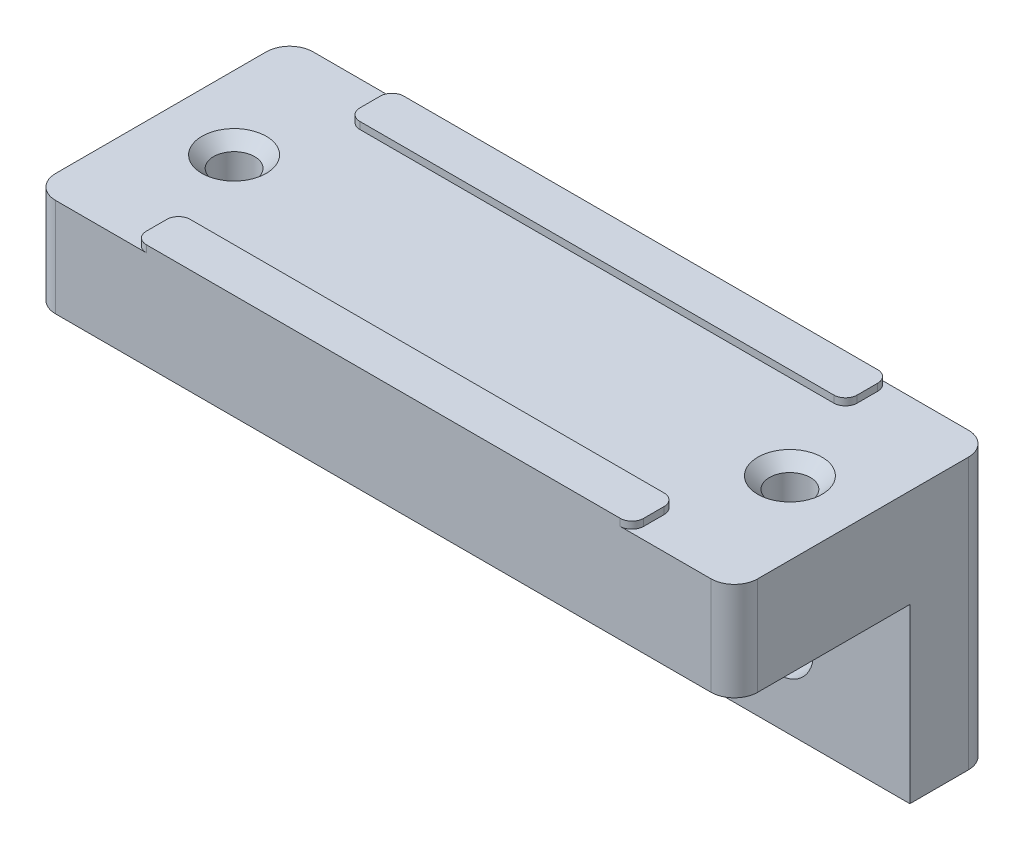
ISO-10303-21;
HEADER;
FILE_DESCRIPTION(('STEP AP214'),'2;1');
FILE_NAME('part.step','',(''),(''),'','','');
FILE_SCHEMA(('AUTOMOTIVE_DESIGN { 1 0 10303 214 1 1 1 1 }'));
ENDSEC;
DATA;
#1=APPLICATION_CONTEXT('core data for automotive mechanical design processes');
#2=APPLICATION_PROTOCOL_DEFINITION('international standard','automotive_design',2000,#1);
#3=PRODUCT_CONTEXT('',#1,'mechanical');
#4=PRODUCT('Part','Part','',(#3));
#5=PRODUCT_RELATED_PRODUCT_CATEGORY('part','',(#4));
#6=PRODUCT_DEFINITION_FORMATION('','',#4);
#7=PRODUCT_DEFINITION_CONTEXT('part definition',#1,'design');
#8=PRODUCT_DEFINITION('design','',#6,#7);
#9=PRODUCT_DEFINITION_SHAPE('','',#8);
#10=(LENGTH_UNIT() NAMED_UNIT(*) SI_UNIT(.MILLI.,.METRE.));
#11=(NAMED_UNIT(*) PLANE_ANGLE_UNIT() SI_UNIT($,.RADIAN.));
#12=(NAMED_UNIT(*) SI_UNIT($,.STERADIAN.) SOLID_ANGLE_UNIT());
#13=UNCERTAINTY_MEASURE_WITH_UNIT(LENGTH_MEASURE(1.E-05),#10,'distance_accuracy_value','');
#14=(GEOMETRIC_REPRESENTATION_CONTEXT(3) GLOBAL_UNCERTAINTY_ASSIGNED_CONTEXT((#13)) GLOBAL_UNIT_ASSIGNED_CONTEXT((#10,
#11,#12)) REPRESENTATION_CONTEXT('',''));
#15=CARTESIAN_POINT('',(0.,0.,0.));
#16=DIRECTION('',(0.,0.,1.));
#17=DIRECTION('',(1.,0.,0.));
#18=AXIS2_PLACEMENT_3D('',#15,#16,#17);
#19=CARTESIAN_POINT('',(15.24,-4.572,-2.032));
#20=DIRECTION('',(0.,0.,-1.));
#21=DIRECTION('',(0.,1.,0.));
#22=AXIS2_PLACEMENT_3D('',#19,#20,#21);
#23=PLANE('',#22);
#24=CARTESIAN_POINT('',(-9.525,-8.5344,-2.032));
#25=DIRECTION('',(0.,0.,1.));
#26=DIRECTION('',(1.,0.,0.));
#27=AXIS2_PLACEMENT_3D('',#24,#25,#26);
#28=CIRCLE('',#27,1.524);
#29=CARTESIAN_POINT('',(-8.001,-8.5344,-2.032));
#30=VERTEX_POINT('',#29);
#31=EDGE_CURVE('E849',#30,#30,#28,.T.);
#32=ORIENTED_EDGE('',*,*,#31,.F.);
#33=EDGE_LOOP('',(#32));
#34=FACE_BOUND('',#33,.T.);
#35=DIRECTION('',(0.,-1.,0.));
#36=VECTOR('',#35,1.);
#37=CARTESIAN_POINT('',(-15.24,-4.572,-2.032));
#38=LINE('',#37,#36);
#39=CARTESIAN_POINT('',(-15.24,-4.572,-2.032));
#40=VERTEX_POINT('',#39);
#41=CARTESIAN_POINT('',(-15.24,-12.065,-2.032));
#42=VERTEX_POINT('',#41);
#43=EDGE_CURVE('E362',#40,#42,#38,.T.);
#44=ORIENTED_EDGE('',*,*,#43,.T.);
#45=DIRECTION('',(-1.,0.,0.));
#46=VECTOR('',#45,1.);
#47=CARTESIAN_POINT('',(15.24,-12.065,-2.032));
#48=LINE('',#47,#46);
#49=CARTESIAN_POINT('',(15.24,-12.065,-2.032));
#50=VERTEX_POINT('',#49);
#51=EDGE_CURVE('E368',#50,#42,#48,.T.);
#52=ORIENTED_EDGE('',*,*,#51,.F.);
#53=DIRECTION('',(0.,-1.,0.));
#54=VECTOR('',#53,1.);
#55=CARTESIAN_POINT('',(15.24,-4.572,-2.032));
#56=LINE('',#55,#54);
#57=CARTESIAN_POINT('',(15.24,-4.572,-2.032));
#58=VERTEX_POINT('',#57);
#59=EDGE_CURVE('E353',#58,#50,#56,.T.);
#60=ORIENTED_EDGE('',*,*,#59,.F.);
#61=DIRECTION('',(-1.,0.,0.));
#62=VECTOR('',#61,1.);
#63=CARTESIAN_POINT('',(15.24,-4.572,-2.032));
#64=LINE('',#63,#62);
#65=EDGE_CURVE('E371',#58,#40,#64,.T.);
#66=ORIENTED_EDGE('',*,*,#65,.T.);
#67=EDGE_LOOP('',(#44,#52,#60,#66));
#68=FACE_BOUND('',#67,.T.);
#69=CARTESIAN_POINT('',(9.525,-8.5344,-2.032));
#70=DIRECTION('',(0.,0.,1.));
#71=DIRECTION('',(1.,0.,0.));
#72=AXIS2_PLACEMENT_3D('',#69,#70,#71);
#73=CIRCLE('',#72,1.524);
#74=CARTESIAN_POINT('',(11.049,-8.5344,-2.032));
#75=VERTEX_POINT('',#74);
#76=EDGE_CURVE('E843',#75,#75,#73,.T.);
#77=ORIENTED_EDGE('',*,*,#76,.F.);
#78=EDGE_LOOP('',(#77));
#79=FACE_BOUND('',#78,.T.);
#80=ADVANCED_FACE('F35',(#34,#68,#79),#23,.F.);
#81=CARTESIAN_POINT('',(15.24,0.,-5.588));
#82=DIRECTION('',(0.,-1.,0.));
#83=DIRECTION('',(0.,0.,-1.));
#84=AXIS2_PLACEMENT_3D('',#81,#82,#83);
#85=PLANE('',#84);
#86=CARTESIAN_POINT('',(-10.287,0.,-5.08));
#87=DIRECTION('',(0.,1.,0.));
#88=DIRECTION('',(0.,0.,-1.));
#89=AXIS2_PLACEMENT_3D('',#86,#87,#88);
#90=CIRCLE('',#89,0.508);
#91=CARTESIAN_POINT('',(-10.287,0.,-5.588));
#92=VERTEX_POINT('',#91);
#93=CARTESIAN_POINT('',(-10.795,0.,-5.08));
#94=VERTEX_POINT('',#93);
#95=EDGE_CURVE('E272',#92,#94,#90,.T.);
#96=ORIENTED_EDGE('',*,*,#95,.T.);
#97=DIRECTION('',(0.,0.,1.));
#98=VECTOR('',#97,1.);
#99=CARTESIAN_POINT('',(-10.795,0.,-4.191));
#100=LINE('',#99,#98);
#101=CARTESIAN_POINT('',(-10.795,0.,-4.191));
#102=VERTEX_POINT('',#101);
#103=EDGE_CURVE('E309',#94,#102,#100,.T.);
#104=ORIENTED_EDGE('',*,*,#103,.T.);
#105=CARTESIAN_POINT('',(-10.287,0.,-4.191));
#106=DIRECTION('',(0.,1.,0.));
#107=DIRECTION('',(0.,0.,-1.));
#108=AXIS2_PLACEMENT_3D('',#105,#106,#107);
#109=CIRCLE('',#108,0.508);
#110=CARTESIAN_POINT('',(-10.287,0.,-3.683));
#111=VERTEX_POINT('',#110);
#112=EDGE_CURVE('E312',#102,#111,#109,.T.);
#113=ORIENTED_EDGE('',*,*,#112,.T.);
#114=DIRECTION('',(1.,0.,0.));
#115=VECTOR('',#114,1.);
#116=CARTESIAN_POINT('',(-10.287,0.,-3.683));
#117=LINE('',#116,#115);
#118=CARTESIAN_POINT('',(10.287,0.,-3.683));
#119=VERTEX_POINT('',#118);
#120=EDGE_CURVE('E315',#111,#119,#117,.T.);
#121=ORIENTED_EDGE('',*,*,#120,.T.);
#122=CARTESIAN_POINT('',(10.287,0.,-4.191));
#123=DIRECTION('',(0.,1.,0.));
#124=DIRECTION('',(0.,0.,1.));
#125=AXIS2_PLACEMENT_3D('',#122,#123,#124);
#126=CIRCLE('',#125,0.508);
#127=CARTESIAN_POINT('',(10.795,0.,-4.191));
#128=VERTEX_POINT('',#127);
#129=EDGE_CURVE('E318',#119,#128,#126,.T.);
#130=ORIENTED_EDGE('',*,*,#129,.T.);
#131=DIRECTION('',(0.,0.,-1.));
#132=VECTOR('',#131,1.);
#133=CARTESIAN_POINT('',(10.795,0.,-4.191));
#134=LINE('',#133,#132);
#135=CARTESIAN_POINT('',(10.795,0.,-5.08));
#136=VERTEX_POINT('',#135);
#137=EDGE_CURVE('E321',#128,#136,#134,.T.);
#138=ORIENTED_EDGE('',*,*,#137,.T.);
#139=CARTESIAN_POINT('',(10.287,0.,-5.08));
#140=DIRECTION('',(0.,1.,0.));
#141=DIRECTION('',(0.,0.,-1.));
#142=AXIS2_PLACEMENT_3D('',#139,#140,#141);
#143=CIRCLE('',#142,0.508);
#144=CARTESIAN_POINT('',(10.287,0.,-5.588));
#145=VERTEX_POINT('',#144);
#146=EDGE_CURVE('E288',#136,#145,#143,.T.);
#147=ORIENTED_EDGE('',*,*,#146,.T.);
#148=DIRECTION('',(-1.,0.,0.));
#149=VECTOR('',#148,1.);
#150=CARTESIAN_POINT('',(15.24,0.,-5.588));
#151=LINE('',#150,#149);
#152=EDGE_CURVE('E380',#145,#92,#151,.T.);
#153=ORIENTED_EDGE('',*,*,#152,.T.);
#154=EDGE_LOOP('',(#96,#104,#113,#121,#130,#138,#147,#153));
#155=FACE_BOUND('',#154,.T.);
#156=ADVANCED_FACE('F473',(#155),#85,.F.);
#157=CARTESIAN_POINT('',(10.287,0.,5.08));
#158=DIRECTION('',(0.,1.,0.));
#159=DIRECTION('',(0.,0.,1.));
#160=AXIS2_PLACEMENT_3D('',#157,#158,#159);
#161=CIRCLE('',#160,0.508);
#162=CARTESIAN_POINT('',(10.287,0.,5.588));
#163=VERTEX_POINT('',#162);
#164=CARTESIAN_POINT('',(10.795,0.,5.08));
#165=VERTEX_POINT('',#164);
#166=EDGE_CURVE('E257',#163,#165,#161,.T.);
#167=ORIENTED_EDGE('',*,*,#166,.T.);
#168=DIRECTION('',(0.,0.,-1.));
#169=VECTOR('',#168,1.);
#170=CARTESIAN_POINT('',(10.795,0.,4.191));
#171=LINE('',#170,#169);
#172=CARTESIAN_POINT('',(10.795,0.,4.191));
#173=VERTEX_POINT('',#172);
#174=EDGE_CURVE('E214',#165,#173,#171,.T.);
#175=ORIENTED_EDGE('',*,*,#174,.T.);
#176=CARTESIAN_POINT('',(10.287,0.,4.191));
#177=DIRECTION('',(0.,1.,0.));
#178=DIRECTION('',(0.,0.,-1.));
#179=AXIS2_PLACEMENT_3D('',#176,#177,#178);
#180=CIRCLE('',#179,0.508);
#181=CARTESIAN_POINT('',(10.287,0.,3.683));
#182=VERTEX_POINT('',#181);
#183=EDGE_CURVE('E260',#173,#182,#180,.T.);
#184=ORIENTED_EDGE('',*,*,#183,.T.);
#185=DIRECTION('',(-1.,0.,0.));
#186=VECTOR('',#185,1.);
#187=CARTESIAN_POINT('',(-10.287,0.,3.683));
#188=LINE('',#187,#186);
#189=CARTESIAN_POINT('',(-10.287,0.,3.683));
#190=VERTEX_POINT('',#189);
#191=EDGE_CURVE('E263',#182,#190,#188,.T.);
#192=ORIENTED_EDGE('',*,*,#191,.T.);
#193=CARTESIAN_POINT('',(-10.287,0.,4.191));
#194=DIRECTION('',(0.,1.,0.));
#195=DIRECTION('',(0.,0.,1.));
#196=AXIS2_PLACEMENT_3D('',#193,#194,#195);
#197=CIRCLE('',#196,0.508);
#198=CARTESIAN_POINT('',(-10.795,0.,4.191));
#199=VERTEX_POINT('',#198);
#200=EDGE_CURVE('E266',#190,#199,#197,.T.);
#201=ORIENTED_EDGE('',*,*,#200,.T.);
#202=DIRECTION('',(0.,0.,1.));
#203=VECTOR('',#202,1.);
#204=CARTESIAN_POINT('',(-10.795,0.,4.191));
#205=LINE('',#204,#203);
#206=CARTESIAN_POINT('',(-10.795,0.,5.08));
#207=VERTEX_POINT('',#206);
#208=EDGE_CURVE('E239',#199,#207,#205,.T.);
#209=ORIENTED_EDGE('',*,*,#208,.T.);
#210=CARTESIAN_POINT('',(-10.287,0.,5.08));
#211=DIRECTION('',(0.,1.,0.));
#212=DIRECTION('',(0.,0.,1.));
#213=AXIS2_PLACEMENT_3D('',#210,#211,#212);
#214=CIRCLE('',#213,0.508);
#215=CARTESIAN_POINT('',(-10.287,0.,5.588));
#216=VERTEX_POINT('',#215);
#217=EDGE_CURVE('E236',#207,#216,#214,.T.);
#218=ORIENTED_EDGE('',*,*,#217,.T.);
#219=DIRECTION('',(-1.,0.,0.));
#220=VECTOR('',#219,1.);
#221=CARTESIAN_POINT('',(15.24,0.,5.588));
#222=LINE('',#221,#220);
#223=EDGE_CURVE('E377',#163,#216,#222,.T.);
#224=ORIENTED_EDGE('',*,*,#223,.F.);
#225=EDGE_LOOP('',(#167,#175,#184,#192,#201,#209,#218,#224));
#226=FACE_BOUND('',#225,.T.);
#227=ADVANCED_FACE('F475',(#226),#85,.F.);
#228=CARTESIAN_POINT('',(15.24,-12.065,-5.588));
#229=DIRECTION('',(-1.,0.,0.));
#230=DIRECTION('',(0.,0.,1.));
#231=AXIS2_PLACEMENT_3D('',#228,#229,#230);
#232=PLANE('',#231);
#233=DIRECTION('',(0.,0.,-1.));
#234=VECTOR('',#233,1.);
#235=CARTESIAN_POINT('',(15.24,-0.304799999999999,-5.588));
#236=LINE('',#235,#234);
#237=CARTESIAN_POINT('',(15.24,-0.304799999999999,4.572));
#238=VERTEX_POINT('',#237);
#239=CARTESIAN_POINT('',(15.24,-0.304799999999999,-4.572));
#240=VERTEX_POINT('',#239);
#241=EDGE_CURVE('E347',#238,#240,#236,.T.);
#242=ORIENTED_EDGE('',*,*,#241,.F.);
#243=DIRECTION('',(0.,-1.,0.));
#244=VECTOR('',#243,1.);
#245=CARTESIAN_POINT('',(15.24,-12.065,4.572));
#246=LINE('',#245,#244);
#247=CARTESIAN_POINT('',(15.24,-4.572,4.572));
#248=VERTEX_POINT('',#247);
#249=EDGE_CURVE('E12',#238,#248,#246,.T.);
#250=ORIENTED_EDGE('',*,*,#249,.T.);
#251=DIRECTION('',(0.,0.,-1.));
#252=VECTOR('',#251,1.);
#253=CARTESIAN_POINT('',(15.24,-4.572,5.588));
#254=LINE('',#253,#252);
#255=EDGE_CURVE('E351',#248,#58,#254,.T.);
#256=ORIENTED_EDGE('',*,*,#255,.T.);
#257=ORIENTED_EDGE('',*,*,#59,.T.);
#258=DIRECTION('',(0.,0.,-1.));
#259=VECTOR('',#258,1.);
#260=CARTESIAN_POINT('',(15.24,-12.065,-5.588));
#261=LINE('',#260,#259);
#262=CARTESIAN_POINT('',(15.24,-12.065,-4.572));
#263=VERTEX_POINT('',#262);
#264=EDGE_CURVE('E356',#50,#263,#261,.T.);
#265=ORIENTED_EDGE('',*,*,#264,.T.);
#266=DIRECTION('',(0.,1.,0.));
#267=VECTOR('',#266,1.);
#268=CARTESIAN_POINT('',(15.24,-12.065,-4.572));
#269=LINE('',#268,#267);
#270=EDGE_CURVE('E43',#263,#240,#269,.T.);
#271=ORIENTED_EDGE('',*,*,#270,.T.);
#272=EDGE_LOOP('',(#242,#250,#256,#257,#265,#271));
#273=FACE_BOUND('',#272,.T.);
#274=ADVANCED_FACE('F416',(#273),#232,.F.);
#275=CARTESIAN_POINT('',(-15.24,-12.065,-5.588));
#276=DIRECTION('',(-1.,0.,0.));
#277=DIRECTION('',(0.,0.,1.));
#278=AXIS2_PLACEMENT_3D('',#275,#276,#277);
#279=PLANE('',#278);
#280=DIRECTION('',(0.,0.,-1.));
#281=VECTOR('',#280,1.);
#282=CARTESIAN_POINT('',(-15.24,-0.304799999999999,-5.588));
#283=LINE('',#282,#281);
#284=CARTESIAN_POINT('',(-15.24,-0.304799999999999,4.572));
#285=VERTEX_POINT('',#284);
#286=CARTESIAN_POINT('',(-15.24,-0.304799999999999,-4.572));
#287=VERTEX_POINT('',#286);
#288=EDGE_CURVE('E383',#285,#287,#283,.T.);
#289=ORIENTED_EDGE('',*,*,#288,.T.);
#290=DIRECTION('',(0.,1.,0.));
#291=VECTOR('',#290,1.);
#292=CARTESIAN_POINT('',(-15.24,-12.065,-4.572));
#293=LINE('',#292,#291);
#294=CARTESIAN_POINT('',(-15.24,-12.065,-4.572));
#295=VERTEX_POINT('',#294);
#296=EDGE_CURVE('E401',#287,#295,#293,.F.);
#297=ORIENTED_EDGE('',*,*,#296,.T.);
#298=DIRECTION('',(0.,0.,-1.));
#299=VECTOR('',#298,1.);
#300=CARTESIAN_POINT('',(-15.24,-12.065,-5.588));
#301=LINE('',#300,#299);
#302=EDGE_CURVE('E354',#42,#295,#301,.T.);
#303=ORIENTED_EDGE('',*,*,#302,.F.);
#304=ORIENTED_EDGE('',*,*,#43,.F.);
#305=DIRECTION('',(0.,0.,-1.));
#306=VECTOR('',#305,1.);
#307=CARTESIAN_POINT('',(-15.24,-4.572,5.588));
#308=LINE('',#307,#306);
#309=CARTESIAN_POINT('',(-15.24,-4.572,4.572));
#310=VERTEX_POINT('',#309);
#311=EDGE_CURVE('E360',#310,#40,#308,.T.);
#312=ORIENTED_EDGE('',*,*,#311,.F.);
#313=DIRECTION('',(0.,-1.,0.));
#314=VECTOR('',#313,1.);
#315=CARTESIAN_POINT('',(-15.24,-0.304799999999999,4.572));
#316=LINE('',#315,#314);
#317=EDGE_CURVE('E399',#310,#285,#316,.F.);
#318=ORIENTED_EDGE('',*,*,#317,.T.);
#319=EDGE_LOOP('',(#289,#297,#303,#304,#312,#318));
#320=FACE_BOUND('',#319,.T.);
#321=ADVANCED_FACE('F490',(#320),#279,.T.);
#322=CARTESIAN_POINT('',(15.24,0.,-5.588));
#323=DIRECTION('',(0.,0.,1.));
#324=DIRECTION('',(0.,-1.,0.));
#325=AXIS2_PLACEMENT_3D('',#322,#323,#324);
#326=PLANE('',#325);
#327=CARTESIAN_POINT('',(-9.525,-8.5344,-5.588));
#328=DIRECTION('',(0.,0.,1.));
#329=DIRECTION('',(1.,0.,0.));
#330=AXIS2_PLACEMENT_3D('',#327,#328,#329);
#331=CIRCLE('',#330,1.524);
#332=CARTESIAN_POINT('',(-8.001,-8.5344,-5.588));
#333=VERTEX_POINT('',#332);
#334=EDGE_CURVE('E846',#333,#333,#331,.T.);
#335=ORIENTED_EDGE('',*,*,#334,.T.);
#336=EDGE_LOOP('',(#335));
#337=FACE_BOUND('',#336,.T.);
#338=CARTESIAN_POINT('',(9.525,-8.5344,-5.588));
#339=DIRECTION('',(0.,0.,1.));
#340=DIRECTION('',(1.,0.,0.));
#341=AXIS2_PLACEMENT_3D('',#338,#339,#340);
#342=CIRCLE('',#341,1.524);
#343=CARTESIAN_POINT('',(11.049,-8.5344,-5.588));
#344=VERTEX_POINT('',#343);
#345=EDGE_CURVE('E840',#344,#344,#342,.T.);
#346=ORIENTED_EDGE('',*,*,#345,.T.);
#347=EDGE_LOOP('',(#346));
#348=FACE_BOUND('',#347,.T.);
#349=DIRECTION('',(-1.,0.,0.));
#350=VECTOR('',#349,1.);
#351=CARTESIAN_POINT('',(15.24,-12.065,-5.588));
#352=LINE('',#351,#350);
#353=CARTESIAN_POINT('',(14.224,-12.065,-5.588));
#354=VERTEX_POINT('',#353);
#355=CARTESIAN_POINT('',(-14.224,-12.065,-5.588));
#356=VERTEX_POINT('',#355);
#357=EDGE_CURVE('E359',#354,#356,#352,.T.);
#358=ORIENTED_EDGE('',*,*,#357,.T.);
#359=DIRECTION('',(0.,1.,0.));
#360=VECTOR('',#359,1.);
#361=CARTESIAN_POINT('',(-14.224,-0.304799999999999,-5.588));
#362=LINE('',#361,#360);
#363=CARTESIAN_POINT('',(-14.224,-0.3048,-5.588));
#364=VERTEX_POINT('',#363);
#365=EDGE_CURVE('E388',#356,#364,#362,.T.);
#366=ORIENTED_EDGE('',*,*,#365,.T.);
#367=DIRECTION('',(-1.,0.,0.));
#368=VECTOR('',#367,1.);
#369=CARTESIAN_POINT('',(15.24,-0.3048,-5.588));
#370=LINE('',#369,#368);
#371=CARTESIAN_POINT('',(-10.287,-0.3048,-5.588));
#372=VERTEX_POINT('',#371);
#373=EDGE_CURVE('E344',#372,#364,#370,.T.);
#374=ORIENTED_EDGE('',*,*,#373,.F.);
#375=DIRECTION('',(0.,1.,0.));
#376=VECTOR('',#375,1.);
#377=CARTESIAN_POINT('',(-10.287,-0.3048,-5.588));
#378=LINE('',#377,#376);
#379=EDGE_CURVE('E326',#372,#92,#378,.T.);
#380=ORIENTED_EDGE('',*,*,#379,.T.);
#381=ORIENTED_EDGE('',*,*,#152,.F.);
#382=DIRECTION('',(0.,1.,0.));
#383=VECTOR('',#382,1.);
#384=CARTESIAN_POINT('',(10.287,-0.3048,-5.588));
#385=LINE('',#384,#383);
#386=CARTESIAN_POINT('',(10.287,-0.3048,-5.588));
#387=VERTEX_POINT('',#386);
#388=EDGE_CURVE('E330',#387,#145,#385,.T.);
#389=ORIENTED_EDGE('',*,*,#388,.F.);
#390=CARTESIAN_POINT('',(14.224,-0.3048,-5.588));
#391=VERTEX_POINT('',#390);
#392=EDGE_CURVE('E348',#391,#387,#370,.T.);
#393=ORIENTED_EDGE('',*,*,#392,.F.);
#394=DIRECTION('',(0.,1.,0.));
#395=VECTOR('',#394,1.);
#396=CARTESIAN_POINT('',(14.224,0.,-5.588));
#397=LINE('',#396,#395);
#398=EDGE_CURVE('E386',#391,#354,#397,.F.);
#399=ORIENTED_EDGE('',*,*,#398,.T.);
#400=EDGE_LOOP('',(#358,#366,#374,#380,#381,#389,#393,#399));
#401=FACE_BOUND('',#400,.T.);
#402=ADVANCED_FACE('F440',(#337,#348,#401),#326,.F.);
#403=CARTESIAN_POINT('',(15.24,0.,5.588));
#404=DIRECTION('',(0.,0.,-1.));
#405=DIRECTION('',(0.,1.,0.));
#406=AXIS2_PLACEMENT_3D('',#403,#404,#405);
#407=PLANE('',#406);
#408=DIRECTION('',(1.,0.,0.));
#409=VECTOR('',#408,1.);
#410=CARTESIAN_POINT('',(15.24,-0.3048,5.588));
#411=LINE('',#410,#409);
#412=CARTESIAN_POINT('',(-14.224,-0.3048,5.588));
#413=VERTEX_POINT('',#412);
#414=CARTESIAN_POINT('',(-10.287,-0.3048,5.588));
#415=VERTEX_POINT('',#414);
#416=EDGE_CURVE('E329',#413,#415,#411,.T.);
#417=ORIENTED_EDGE('',*,*,#416,.F.);
#418=DIRECTION('',(0.,-1.,0.));
#419=VECTOR('',#418,1.);
#420=CARTESIAN_POINT('',(-14.224,-4.572,5.588));
#421=LINE('',#420,#419);
#422=CARTESIAN_POINT('',(-14.224,-4.572,5.588));
#423=VERTEX_POINT('',#422);
#424=EDGE_CURVE('E409',#413,#423,#421,.T.);
#425=ORIENTED_EDGE('',*,*,#424,.T.);
#426=DIRECTION('',(-1.,0.,0.));
#427=VECTOR('',#426,1.);
#428=CARTESIAN_POINT('',(15.24,-4.572,5.588));
#429=LINE('',#428,#427);
#430=CARTESIAN_POINT('',(14.224,-4.572,5.588));
#431=VERTEX_POINT('',#430);
#432=EDGE_CURVE('E374',#431,#423,#429,.T.);
#433=ORIENTED_EDGE('',*,*,#432,.F.);
#434=DIRECTION('',(0.,-1.,0.));
#435=VECTOR('',#434,1.);
#436=CARTESIAN_POINT('',(14.224,0.,5.588));
#437=LINE('',#436,#435);
#438=CARTESIAN_POINT('',(14.224,-0.3048,5.588));
#439=VERTEX_POINT('',#438);
#440=EDGE_CURVE('E407',#431,#439,#437,.F.);
#441=ORIENTED_EDGE('',*,*,#440,.T.);
#442=CARTESIAN_POINT('',(10.287,-0.3048,5.588));
#443=VERTEX_POINT('',#442);
#444=EDGE_CURVE('E345',#443,#439,#411,.T.);
#445=ORIENTED_EDGE('',*,*,#444,.F.);
#446=DIRECTION('',(0.,1.,0.));
#447=VECTOR('',#446,1.);
#448=CARTESIAN_POINT('',(10.287,-0.3048,5.588));
#449=LINE('',#448,#447);
#450=EDGE_CURVE('E235',#443,#163,#449,.T.);
#451=ORIENTED_EDGE('',*,*,#450,.T.);
#452=ORIENTED_EDGE('',*,*,#223,.T.);
#453=DIRECTION('',(0.,1.,0.));
#454=VECTOR('',#453,1.);
#455=CARTESIAN_POINT('',(-10.287,-0.3048,5.588));
#456=LINE('',#455,#454);
#457=EDGE_CURVE('E273',#415,#216,#456,.T.);
#458=ORIENTED_EDGE('',*,*,#457,.F.);
#459=EDGE_LOOP('',(#417,#425,#433,#441,#445,#451,#452,#458));
#460=FACE_BOUND('',#459,.T.);
#461=ADVANCED_FACE('F486',(#460),#407,.F.);
#462=CARTESIAN_POINT('',(15.24,-4.572,5.588));
#463=DIRECTION('',(0.,1.,0.));
#464=DIRECTION('',(0.,0.,1.));
#465=AXIS2_PLACEMENT_3D('',#462,#463,#464);
#466=PLANE('',#465);
#467=CARTESIAN_POINT('',(-12.065,-4.572,0.));
#468=DIRECTION('',(0.,1.,0.));
#469=DIRECTION('',(0.,0.,1.));
#470=AXIS2_PLACEMENT_3D('',#467,#468,#469);
#471=CIRCLE('',#470,1.397);
#472=CARTESIAN_POINT('',(-12.065,-4.572,1.397));
#473=VERTEX_POINT('',#472);
#474=EDGE_CURVE('E837',#473,#473,#471,.T.);
#475=ORIENTED_EDGE('',*,*,#474,.T.);
#476=EDGE_LOOP('',(#475));
#477=FACE_BOUND('',#476,.T.);
#478=CARTESIAN_POINT('',(12.065,-4.572,0.));
#479=DIRECTION('',(0.,1.,0.));
#480=DIRECTION('',(0.,0.,1.));
#481=AXIS2_PLACEMENT_3D('',#478,#479,#480);
#482=CIRCLE('',#481,1.397);
#483=CARTESIAN_POINT('',(12.065,-4.572,1.397));
#484=VERTEX_POINT('',#483);
#485=EDGE_CURVE('E816',#484,#484,#482,.T.);
#486=ORIENTED_EDGE('',*,*,#485,.T.);
#487=EDGE_LOOP('',(#486));
#488=FACE_BOUND('',#487,.T.);
#489=ORIENTED_EDGE('',*,*,#432,.T.);
#490=CARTESIAN_POINT('',(-14.224,-4.572,4.572));
#491=DIRECTION('',(0.,1.,0.));
#492=DIRECTION('',(0.,0.,1.));
#493=AXIS2_PLACEMENT_3D('',#490,#491,#492);
#494=CIRCLE('',#493,1.016);
#495=EDGE_CURVE('E57',#423,#310,#494,.F.);
#496=ORIENTED_EDGE('',*,*,#495,.T.);
#497=ORIENTED_EDGE('',*,*,#311,.T.);
#498=ORIENTED_EDGE('',*,*,#65,.F.);
#499=ORIENTED_EDGE('',*,*,#255,.F.);
#500=CARTESIAN_POINT('',(14.224,-4.572,4.572));
#501=DIRECTION('',(0.,1.,0.));
#502=DIRECTION('',(0.,0.,1.));
#503=AXIS2_PLACEMENT_3D('',#500,#501,#502);
#504=CIRCLE('',#503,1.016);
#505=EDGE_CURVE('E50',#248,#431,#504,.F.);
#506=ORIENTED_EDGE('',*,*,#505,.T.);
#507=EDGE_LOOP('',(#489,#496,#497,#498,#499,#506));
#508=FACE_BOUND('',#507,.T.);
#509=ADVANCED_FACE('F426',(#477,#488,#508),#466,.F.);
#510=CARTESIAN_POINT('',(15.24,-12.065,-5.588));
#511=DIRECTION('',(0.,1.,0.));
#512=DIRECTION('',(0.,0.,1.));
#513=AXIS2_PLACEMENT_3D('',#510,#511,#512);
#514=PLANE('',#513);
#515=ORIENTED_EDGE('',*,*,#302,.T.);
#516=CARTESIAN_POINT('',(-14.224,-12.065,-4.572));
#517=DIRECTION('',(0.,1.,0.));
#518=DIRECTION('',(0.,0.,1.));
#519=AXIS2_PLACEMENT_3D('',#516,#517,#518);
#520=CIRCLE('',#519,1.016);
#521=EDGE_CURVE('E405',#295,#356,#520,.F.);
#522=ORIENTED_EDGE('',*,*,#521,.T.);
#523=ORIENTED_EDGE('',*,*,#357,.F.);
#524=CARTESIAN_POINT('',(14.224,-12.065,-4.572));
#525=DIRECTION('',(0.,1.,0.));
#526=DIRECTION('',(0.,0.,1.));
#527=AXIS2_PLACEMENT_3D('',#524,#525,#526);
#528=CIRCLE('',#527,1.016);
#529=EDGE_CURVE('E403',#354,#263,#528,.F.);
#530=ORIENTED_EDGE('',*,*,#529,.T.);
#531=ORIENTED_EDGE('',*,*,#264,.F.);
#532=ORIENTED_EDGE('',*,*,#51,.T.);
#533=EDGE_LOOP('',(#515,#522,#523,#530,#531,#532));
#534=FACE_BOUND('',#533,.T.);
#535=ADVANCED_FACE('F436',(#534),#514,.F.);
#536=CARTESIAN_POINT('',(0.,-0.3048,0.));
#537=DIRECTION('',(0.,1.,0.));
#538=DIRECTION('',(0.,0.,1.));
#539=AXIS2_PLACEMENT_3D('',#536,#537,#538);
#540=PLANE('',#539);
#541=CARTESIAN_POINT('',(-12.065,-0.304799999999998,0.));
#542=DIRECTION('',(0.,1.,0.));
#543=DIRECTION('',(0.,0.,1.));
#544=AXIS2_PLACEMENT_3D('',#541,#542,#543);
#545=CIRCLE('',#544,1.397);
#546=CARTESIAN_POINT('',(-12.065,-0.304799999999998,1.397));
#547=VERTEX_POINT('',#546);
#548=EDGE_CURVE('E834',#547,#547,#545,.T.);
#549=ORIENTED_EDGE('',*,*,#548,.F.);
#550=EDGE_LOOP('',(#549));
#551=FACE_BOUND('',#550,.T.);
#552=CARTESIAN_POINT('',(12.065,-0.304799999999998,0.));
#553=DIRECTION('',(0.,1.,0.));
#554=DIRECTION('',(0.,0.,1.));
#555=AXIS2_PLACEMENT_3D('',#552,#553,#554);
#556=CIRCLE('',#555,1.397);
#557=CARTESIAN_POINT('',(12.065,-0.304799999999998,1.397));
#558=VERTEX_POINT('',#557);
#559=EDGE_CURVE('E821',#558,#558,#556,.T.);
#560=ORIENTED_EDGE('',*,*,#559,.F.);
#561=EDGE_LOOP('',(#560));
#562=FACE_BOUND('',#561,.T.);
#563=ORIENTED_EDGE('',*,*,#373,.T.);
#564=CARTESIAN_POINT('',(-14.224,-0.3048,-4.572));
#565=DIRECTION('',(0.,1.,0.));
#566=DIRECTION('',(0.,0.,1.));
#567=AXIS2_PLACEMENT_3D('',#564,#565,#566);
#568=CIRCLE('',#567,1.016);
#569=EDGE_CURVE('E397',#364,#287,#568,.T.);
#570=ORIENTED_EDGE('',*,*,#569,.T.);
#571=ORIENTED_EDGE('',*,*,#288,.F.);
#572=CARTESIAN_POINT('',(-14.224,-0.3048,4.572));
#573=DIRECTION('',(0.,1.,0.));
#574=DIRECTION('',(0.,0.,1.));
#575=AXIS2_PLACEMENT_3D('',#572,#573,#574);
#576=CIRCLE('',#575,1.016);
#577=EDGE_CURVE('E395',#285,#413,#576,.T.);
#578=ORIENTED_EDGE('',*,*,#577,.T.);
#579=ORIENTED_EDGE('',*,*,#416,.T.);
#580=CARTESIAN_POINT('',(-10.287,-0.3048,5.08));
#581=DIRECTION('',(0.,1.,0.));
#582=DIRECTION('',(0.,0.,1.));
#583=AXIS2_PLACEMENT_3D('',#580,#581,#582);
#584=CIRCLE('',#583,0.508);
#585=CARTESIAN_POINT('',(-10.795,-0.3048,5.08));
#586=VERTEX_POINT('',#585);
#587=EDGE_CURVE('E219',#586,#415,#584,.T.);
#588=ORIENTED_EDGE('',*,*,#587,.F.);
#589=DIRECTION('',(0.,0.,1.));
#590=VECTOR('',#589,1.);
#591=CARTESIAN_POINT('',(-10.795,-0.3048,4.191));
#592=LINE('',#591,#590);
#593=CARTESIAN_POINT('',(-10.795,-0.3048,4.191));
#594=VERTEX_POINT('',#593);
#595=EDGE_CURVE('E252',#594,#586,#592,.T.);
#596=ORIENTED_EDGE('',*,*,#595,.F.);
#597=CARTESIAN_POINT('',(-10.287,-0.3048,4.191));
#598=DIRECTION('',(0.,1.,0.));
#599=DIRECTION('',(0.,0.,1.));
#600=AXIS2_PLACEMENT_3D('',#597,#598,#599);
#601=CIRCLE('',#600,0.508);
#602=CARTESIAN_POINT('',(-10.287,-0.3048,3.683));
#603=VERTEX_POINT('',#602);
#604=EDGE_CURVE('E249',#603,#594,#601,.T.);
#605=ORIENTED_EDGE('',*,*,#604,.F.);
#606=DIRECTION('',(-1.,0.,0.));
#607=VECTOR('',#606,1.);
#608=CARTESIAN_POINT('',(-10.287,-0.3048,3.683));
#609=LINE('',#608,#607);
#610=CARTESIAN_POINT('',(10.287,-0.3048,3.683));
#611=VERTEX_POINT('',#610);
#612=EDGE_CURVE('E246',#611,#603,#609,.T.);
#613=ORIENTED_EDGE('',*,*,#612,.F.);
#614=CARTESIAN_POINT('',(10.287,-0.3048,4.191));
#615=DIRECTION('',(0.,1.,0.));
#616=DIRECTION('',(0.,0.,-1.));
#617=AXIS2_PLACEMENT_3D('',#614,#615,#616);
#618=CIRCLE('',#617,0.508);
#619=CARTESIAN_POINT('',(10.795,-0.3048,4.191));
#620=VERTEX_POINT('',#619);
#621=EDGE_CURVE('E230',#620,#611,#618,.T.);
#622=ORIENTED_EDGE('',*,*,#621,.F.);
#623=DIRECTION('',(0.,0.,-1.));
#624=VECTOR('',#623,1.);
#625=CARTESIAN_POINT('',(10.795,-0.3048,4.191));
#626=LINE('',#625,#624);
#627=CARTESIAN_POINT('',(10.795,-0.3048,5.08));
#628=VERTEX_POINT('',#627);
#629=EDGE_CURVE('E212',#628,#620,#626,.T.);
#630=ORIENTED_EDGE('',*,*,#629,.F.);
#631=CARTESIAN_POINT('',(10.287,-0.3048,5.08));
#632=DIRECTION('',(0.,1.,0.));
#633=DIRECTION('',(0.,0.,1.));
#634=AXIS2_PLACEMENT_3D('',#631,#632,#633);
#635=CIRCLE('',#634,0.508);
#636=EDGE_CURVE('E226',#443,#628,#635,.T.);
#637=ORIENTED_EDGE('',*,*,#636,.F.);
#638=ORIENTED_EDGE('',*,*,#444,.T.);
#639=CARTESIAN_POINT('',(14.224,-0.304799999999999,4.572));
#640=DIRECTION('',(0.,1.,0.));
#641=DIRECTION('',(0.,0.,1.));
#642=AXIS2_PLACEMENT_3D('',#639,#640,#641);
#643=CIRCLE('',#642,1.016);
#644=EDGE_CURVE('E393',#439,#238,#643,.T.);
#645=ORIENTED_EDGE('',*,*,#644,.T.);
#646=ORIENTED_EDGE('',*,*,#241,.T.);
#647=CARTESIAN_POINT('',(14.224,-0.304799999999999,-4.572));
#648=DIRECTION('',(0.,1.,0.));
#649=DIRECTION('',(0.,0.,1.));
#650=AXIS2_PLACEMENT_3D('',#647,#648,#649);
#651=CIRCLE('',#650,1.016);
#652=EDGE_CURVE('E391',#240,#391,#651,.T.);
#653=ORIENTED_EDGE('',*,*,#652,.T.);
#654=ORIENTED_EDGE('',*,*,#392,.T.);
#655=CARTESIAN_POINT('',(10.287,-0.3048,-5.08));
#656=DIRECTION('',(0.,1.,0.));
#657=DIRECTION('',(0.,0.,-1.));
#658=AXIS2_PLACEMENT_3D('',#655,#656,#657);
#659=CIRCLE('',#658,0.508);
#660=CARTESIAN_POINT('',(10.795,-0.3048,-5.08));
#661=VERTEX_POINT('',#660);
#662=EDGE_CURVE('E303',#661,#387,#659,.T.);
#663=ORIENTED_EDGE('',*,*,#662,.F.);
#664=DIRECTION('',(0.,0.,-1.));
#665=VECTOR('',#664,1.);
#666=CARTESIAN_POINT('',(10.795,-0.3048,-4.191));
#667=LINE('',#666,#665);
#668=CARTESIAN_POINT('',(10.795,-0.3048,-4.191));
#669=VERTEX_POINT('',#668);
#670=EDGE_CURVE('E300',#669,#661,#667,.T.);
#671=ORIENTED_EDGE('',*,*,#670,.F.);
#672=CARTESIAN_POINT('',(10.287,-0.3048,-4.191));
#673=DIRECTION('',(0.,1.,0.));
#674=DIRECTION('',(0.,0.,1.));
#675=AXIS2_PLACEMENT_3D('',#672,#673,#674);
#676=CIRCLE('',#675,0.508);
#677=CARTESIAN_POINT('',(10.287,-0.3048,-3.683));
#678=VERTEX_POINT('',#677);
#679=EDGE_CURVE('E297',#678,#669,#676,.T.);
#680=ORIENTED_EDGE('',*,*,#679,.F.);
#681=DIRECTION('',(1.,0.,0.));
#682=VECTOR('',#681,1.);
#683=CARTESIAN_POINT('',(-10.287,-0.3048,-3.683));
#684=LINE('',#683,#682);
#685=CARTESIAN_POINT('',(-10.287,-0.3048,-3.683));
#686=VERTEX_POINT('',#685);
#687=EDGE_CURVE('E294',#686,#678,#684,.T.);
#688=ORIENTED_EDGE('',*,*,#687,.F.);
#689=CARTESIAN_POINT('',(-10.287,-0.3048,-4.191));
#690=DIRECTION('',(0.,1.,0.));
#691=DIRECTION('',(0.,0.,-1.));
#692=AXIS2_PLACEMENT_3D('',#689,#690,#691);
#693=CIRCLE('',#692,0.508);
#694=CARTESIAN_POINT('',(-10.795,-0.3048,-4.191));
#695=VERTEX_POINT('',#694);
#696=EDGE_CURVE('E291',#695,#686,#693,.T.);
#697=ORIENTED_EDGE('',*,*,#696,.F.);
#698=DIRECTION('',(0.,0.,1.));
#699=VECTOR('',#698,1.);
#700=CARTESIAN_POINT('',(-10.795,-0.3048,-4.191));
#701=LINE('',#700,#699);
#702=CARTESIAN_POINT('',(-10.795,-0.3048,-5.08));
#703=VERTEX_POINT('',#702);
#704=EDGE_CURVE('E287',#703,#695,#701,.T.);
#705=ORIENTED_EDGE('',*,*,#704,.F.);
#706=CARTESIAN_POINT('',(-10.287,-0.3048,-5.08));
#707=DIRECTION('',(0.,1.,0.));
#708=DIRECTION('',(0.,0.,-1.));
#709=AXIS2_PLACEMENT_3D('',#706,#707,#708);
#710=CIRCLE('',#709,0.508);
#711=EDGE_CURVE('E284',#372,#703,#710,.T.);
#712=ORIENTED_EDGE('',*,*,#711,.F.);
#713=EDGE_LOOP('',(#563,#570,#571,#578,#579,#588,#596,#605,#613,#622,#630,#637,#638,#645,#646,
#653,#654,#663,#671,#680,#688,#697,#705,#712));
#714=FACE_BOUND('',#713,.T.);
#715=ADVANCED_FACE('F224',(#551,#562,#714),#540,.T.);
#716=CARTESIAN_POINT('',(-10.287,-0.3048,-5.08));
#717=DIRECTION('',(0.,1.,0.));
#718=DIRECTION('',(0.,0.,1.));
#719=AXIS2_PLACEMENT_3D('',#716,#717,#718);
#720=CYLINDRICAL_SURFACE('',#719,0.508);
#721=ORIENTED_EDGE('',*,*,#95,.F.);
#722=ORIENTED_EDGE('',*,*,#379,.F.);
#723=ORIENTED_EDGE('',*,*,#711,.T.);
#724=DIRECTION('',(0.,1.,0.));
#725=VECTOR('',#724,1.);
#726=CARTESIAN_POINT('',(-10.795,-0.3048,-5.08));
#727=LINE('',#726,#725);
#728=EDGE_CURVE('E306',#703,#94,#727,.T.);
#729=ORIENTED_EDGE('',*,*,#728,.T.);
#730=EDGE_LOOP('',(#721,#722,#723,#729));
#731=FACE_BOUND('',#730,.T.);
#732=ADVANCED_FACE('F471',(#731),#720,.T.);
#733=CARTESIAN_POINT('',(10.287,-0.3048,-5.08));
#734=DIRECTION('',(0.,1.,0.));
#735=DIRECTION('',(0.,0.,1.));
#736=AXIS2_PLACEMENT_3D('',#733,#734,#735);
#737=CYLINDRICAL_SURFACE('',#736,0.508);
#738=ORIENTED_EDGE('',*,*,#146,.F.);
#739=DIRECTION('',(0.,1.,0.));
#740=VECTOR('',#739,1.);
#741=CARTESIAN_POINT('',(10.795,-0.3048,-5.08));
#742=LINE('',#741,#740);
#743=EDGE_CURVE('E332',#661,#136,#742,.T.);
#744=ORIENTED_EDGE('',*,*,#743,.F.);
#745=ORIENTED_EDGE('',*,*,#662,.T.);
#746=ORIENTED_EDGE('',*,*,#388,.T.);
#747=EDGE_LOOP('',(#738,#744,#745,#746));
#748=FACE_BOUND('',#747,.T.);
#749=ADVANCED_FACE('F448',(#748),#737,.T.);
#750=CARTESIAN_POINT('',(10.795,-0.3048,-4.191));
#751=DIRECTION('',(1.,0.,0.));
#752=DIRECTION('',(0.,0.,-1.));
#753=AXIS2_PLACEMENT_3D('',#750,#751,#752);
#754=PLANE('',#753);
#755=ORIENTED_EDGE('',*,*,#137,.F.);
#756=DIRECTION('',(0.,1.,0.));
#757=VECTOR('',#756,1.);
#758=CARTESIAN_POINT('',(10.795,-0.3048,-4.191));
#759=LINE('',#758,#757);
#760=EDGE_CURVE('E334',#669,#128,#759,.T.);
#761=ORIENTED_EDGE('',*,*,#760,.F.);
#762=ORIENTED_EDGE('',*,*,#670,.T.);
#763=ORIENTED_EDGE('',*,*,#743,.T.);
#764=EDGE_LOOP('',(#755,#761,#762,#763));
#765=FACE_BOUND('',#764,.T.);
#766=ADVANCED_FACE('F451',(#765),#754,.T.);
#767=CARTESIAN_POINT('',(10.287,-0.3048,-4.191));
#768=DIRECTION('',(0.,1.,0.));
#769=DIRECTION('',(0.,0.,1.));
#770=AXIS2_PLACEMENT_3D('',#767,#768,#769);
#771=CYLINDRICAL_SURFACE('',#770,0.508);
#772=ORIENTED_EDGE('',*,*,#129,.F.);
#773=DIRECTION('',(0.,1.,0.));
#774=VECTOR('',#773,1.);
#775=CARTESIAN_POINT('',(10.287,-0.3048,-3.683));
#776=LINE('',#775,#774);
#777=EDGE_CURVE('E336',#678,#119,#776,.T.);
#778=ORIENTED_EDGE('',*,*,#777,.F.);
#779=ORIENTED_EDGE('',*,*,#679,.T.);
#780=ORIENTED_EDGE('',*,*,#760,.T.);
#781=EDGE_LOOP('',(#772,#778,#779,#780));
#782=FACE_BOUND('',#781,.T.);
#783=ADVANCED_FACE('F456',(#782),#771,.T.);
#784=CARTESIAN_POINT('',(-10.287,-0.3048,-3.683));
#785=DIRECTION('',(0.,0.,1.));
#786=DIRECTION('',(1.,0.,0.));
#787=AXIS2_PLACEMENT_3D('',#784,#785,#786);
#788=PLANE('',#787);
#789=ORIENTED_EDGE('',*,*,#120,.F.);
#790=DIRECTION('',(0.,1.,0.));
#791=VECTOR('',#790,1.);
#792=CARTESIAN_POINT('',(-10.287,-0.3048,-3.683));
#793=LINE('',#792,#791);
#794=EDGE_CURVE('E338',#686,#111,#793,.T.);
#795=ORIENTED_EDGE('',*,*,#794,.F.);
#796=ORIENTED_EDGE('',*,*,#687,.T.);
#797=ORIENTED_EDGE('',*,*,#777,.T.);
#798=EDGE_LOOP('',(#789,#795,#796,#797));
#799=FACE_BOUND('',#798,.T.);
#800=ADVANCED_FACE('F459',(#799),#788,.T.);
#801=CARTESIAN_POINT('',(-10.287,-0.3048,-4.191));
#802=DIRECTION('',(0.,1.,0.));
#803=DIRECTION('',(0.,0.,1.));
#804=AXIS2_PLACEMENT_3D('',#801,#802,#803);
#805=CYLINDRICAL_SURFACE('',#804,0.508);
#806=ORIENTED_EDGE('',*,*,#112,.F.);
#807=DIRECTION('',(0.,1.,0.));
#808=VECTOR('',#807,1.);
#809=CARTESIAN_POINT('',(-10.795,-0.3048,-4.191));
#810=LINE('',#809,#808);
#811=EDGE_CURVE('E340',#695,#102,#810,.T.);
#812=ORIENTED_EDGE('',*,*,#811,.F.);
#813=ORIENTED_EDGE('',*,*,#696,.T.);
#814=ORIENTED_EDGE('',*,*,#794,.T.);
#815=EDGE_LOOP('',(#806,#812,#813,#814));
#816=FACE_BOUND('',#815,.T.);
#817=ADVANCED_FACE('F464',(#816),#805,.T.);
#818=CARTESIAN_POINT('',(-10.795,-0.3048,-4.191));
#819=DIRECTION('',(-1.,0.,0.));
#820=DIRECTION('',(0.,0.,1.));
#821=AXIS2_PLACEMENT_3D('',#818,#819,#820);
#822=PLANE('',#821);
#823=ORIENTED_EDGE('',*,*,#103,.F.);
#824=ORIENTED_EDGE('',*,*,#728,.F.);
#825=ORIENTED_EDGE('',*,*,#704,.T.);
#826=ORIENTED_EDGE('',*,*,#811,.T.);
#827=EDGE_LOOP('',(#823,#824,#825,#826));
#828=FACE_BOUND('',#827,.T.);
#829=ADVANCED_FACE('F467',(#828),#822,.T.);
#830=CARTESIAN_POINT('',(10.287,-0.3048,5.08));
#831=DIRECTION('',(0.,1.,0.));
#832=DIRECTION('',(0.,0.,1.));
#833=AXIS2_PLACEMENT_3D('',#830,#831,#832);
#834=CYLINDRICAL_SURFACE('',#833,0.508);
#835=ORIENTED_EDGE('',*,*,#166,.F.);
#836=ORIENTED_EDGE('',*,*,#450,.F.);
#837=ORIENTED_EDGE('',*,*,#636,.T.);
#838=DIRECTION('',(0.,1.,0.));
#839=VECTOR('',#838,1.);
#840=CARTESIAN_POINT('',(10.795,-0.3048,5.08));
#841=LINE('',#840,#839);
#842=EDGE_CURVE('E209',#628,#165,#841,.T.);
#843=ORIENTED_EDGE('',*,*,#842,.T.);
#844=EDGE_LOOP('',(#835,#836,#837,#843));
#845=FACE_BOUND('',#844,.T.);
#846=ADVANCED_FACE('F233',(#845),#834,.T.);
#847=CARTESIAN_POINT('',(-10.287,-0.3048,5.08));
#848=DIRECTION('',(0.,1.,0.));
#849=DIRECTION('',(0.,0.,1.));
#850=AXIS2_PLACEMENT_3D('',#847,#848,#849);
#851=CYLINDRICAL_SURFACE('',#850,0.508);
#852=ORIENTED_EDGE('',*,*,#217,.F.);
#853=DIRECTION('',(0.,1.,0.));
#854=VECTOR('',#853,1.);
#855=CARTESIAN_POINT('',(-10.795,-0.3048,5.08));
#856=LINE('',#855,#854);
#857=EDGE_CURVE('E275',#586,#207,#856,.T.);
#858=ORIENTED_EDGE('',*,*,#857,.F.);
#859=ORIENTED_EDGE('',*,*,#587,.T.);
#860=ORIENTED_EDGE('',*,*,#457,.T.);
#861=EDGE_LOOP('',(#852,#858,#859,#860));
#862=FACE_BOUND('',#861,.T.);
#863=ADVANCED_FACE('F714',(#862),#851,.T.);
#864=CARTESIAN_POINT('',(-10.795,-0.3048,4.191));
#865=DIRECTION('',(-1.,0.,0.));
#866=DIRECTION('',(0.,0.,1.));
#867=AXIS2_PLACEMENT_3D('',#864,#865,#866);
#868=PLANE('',#867);
#869=ORIENTED_EDGE('',*,*,#208,.F.);
#870=DIRECTION('',(0.,1.,0.));
#871=VECTOR('',#870,1.);
#872=CARTESIAN_POINT('',(-10.795,-0.3048,4.191));
#873=LINE('',#872,#871);
#874=EDGE_CURVE('E277',#594,#199,#873,.T.);
#875=ORIENTED_EDGE('',*,*,#874,.F.);
#876=ORIENTED_EDGE('',*,*,#595,.T.);
#877=ORIENTED_EDGE('',*,*,#857,.T.);
#878=EDGE_LOOP('',(#869,#875,#876,#877));
#879=FACE_BOUND('',#878,.T.);
#880=ADVANCED_FACE('F704',(#879),#868,.T.);
#881=CARTESIAN_POINT('',(-10.287,-0.3048,4.191));
#882=DIRECTION('',(0.,1.,0.));
#883=DIRECTION('',(0.,0.,1.));
#884=AXIS2_PLACEMENT_3D('',#881,#882,#883);
#885=CYLINDRICAL_SURFACE('',#884,0.508);
#886=ORIENTED_EDGE('',*,*,#200,.F.);
#887=DIRECTION('',(0.,1.,0.));
#888=VECTOR('',#887,1.);
#889=CARTESIAN_POINT('',(-10.287,-0.3048,3.683));
#890=LINE('',#889,#888);
#891=EDGE_CURVE('E279',#603,#190,#890,.T.);
#892=ORIENTED_EDGE('',*,*,#891,.F.);
#893=ORIENTED_EDGE('',*,*,#604,.T.);
#894=ORIENTED_EDGE('',*,*,#874,.T.);
#895=EDGE_LOOP('',(#886,#892,#893,#894));
#896=FACE_BOUND('',#895,.T.);
#897=ADVANCED_FACE('F694',(#896),#885,.T.);
#898=CARTESIAN_POINT('',(-10.287,-0.3048,3.683));
#899=DIRECTION('',(0.,0.,-1.));
#900=DIRECTION('',(-1.,0.,0.));
#901=AXIS2_PLACEMENT_3D('',#898,#899,#900);
#902=PLANE('',#901);
#903=ORIENTED_EDGE('',*,*,#191,.F.);
#904=DIRECTION('',(0.,1.,0.));
#905=VECTOR('',#904,1.);
#906=CARTESIAN_POINT('',(10.287,-0.3048,3.683));
#907=LINE('',#906,#905);
#908=EDGE_CURVE('E281',#611,#182,#907,.T.);
#909=ORIENTED_EDGE('',*,*,#908,.F.);
#910=ORIENTED_EDGE('',*,*,#612,.T.);
#911=ORIENTED_EDGE('',*,*,#891,.T.);
#912=EDGE_LOOP('',(#903,#909,#910,#911));
#913=FACE_BOUND('',#912,.T.);
#914=ADVANCED_FACE('F684',(#913),#902,.T.);
#915=CARTESIAN_POINT('',(10.287,-0.3048,4.191));
#916=DIRECTION('',(0.,1.,0.));
#917=DIRECTION('',(0.,0.,1.));
#918=AXIS2_PLACEMENT_3D('',#915,#916,#917);
#919=CYLINDRICAL_SURFACE('',#918,0.508);
#920=ORIENTED_EDGE('',*,*,#183,.F.);
#921=DIRECTION('',(0.,1.,0.));
#922=VECTOR('',#921,1.);
#923=CARTESIAN_POINT('',(10.795,-0.3048,4.191));
#924=LINE('',#923,#922);
#925=EDGE_CURVE('E218',#620,#173,#924,.T.);
#926=ORIENTED_EDGE('',*,*,#925,.F.);
#927=ORIENTED_EDGE('',*,*,#621,.T.);
#928=ORIENTED_EDGE('',*,*,#908,.T.);
#929=EDGE_LOOP('',(#920,#926,#927,#928));
#930=FACE_BOUND('',#929,.T.);
#931=ADVANCED_FACE('F675',(#930),#919,.T.);
#932=CARTESIAN_POINT('',(10.795,-0.3048,4.191));
#933=DIRECTION('',(1.,0.,0.));
#934=DIRECTION('',(0.,0.,-1.));
#935=AXIS2_PLACEMENT_3D('',#932,#933,#934);
#936=PLANE('',#935);
#937=ORIENTED_EDGE('',*,*,#174,.F.);
#938=ORIENTED_EDGE('',*,*,#842,.F.);
#939=ORIENTED_EDGE('',*,*,#629,.T.);
#940=ORIENTED_EDGE('',*,*,#925,.T.);
#941=EDGE_LOOP('',(#937,#938,#939,#940));
#942=FACE_BOUND('',#941,.T.);
#943=ADVANCED_FACE('F211',(#942),#936,.T.);
#944=CARTESIAN_POINT('',(12.065,-4.064,0.));
#945=DIRECTION('',(0.,-1.,0.));
#946=DIRECTION('',(0.,0.,-1.));
#947=AXIS2_PLACEMENT_3D('',#944,#945,#946);
#948=CONICAL_SURFACE('',#947,0.888999999999997,0.785398163397448);
#949=ORIENTED_EDGE('',*,*,#485,.F.);
#950=EDGE_LOOP('',(#949));
#951=FACE_BOUND('',#950,.T.);
#952=CARTESIAN_POINT('',(12.065,-4.064,0.));
#953=DIRECTION('',(0.,1.,0.));
#954=DIRECTION('',(0.,0.,1.));
#955=AXIS2_PLACEMENT_3D('',#952,#953,#954);
#956=CIRCLE('',#955,0.888999999999997);
#957=CARTESIAN_POINT('',(12.065,-4.064,0.888999999999995));
#958=VERTEX_POINT('',#957);
#959=EDGE_CURVE('E242',#958,#958,#956,.T.);
#960=ORIENTED_EDGE('',*,*,#959,.T.);
#961=EDGE_LOOP('',(#960));
#962=FACE_BOUND('',#961,.T.);
#963=ADVANCED_FACE('F656',(#951,#962),#948,.F.);
#964=CARTESIAN_POINT('',(12.065,-0.3048,0.));
#965=DIRECTION('',(0.,1.,0.));
#966=DIRECTION('',(0.,0.,1.));
#967=AXIS2_PLACEMENT_3D('',#964,#965,#966);
#968=CYLINDRICAL_SURFACE('',#967,0.888999999999998);
#969=ORIENTED_EDGE('',*,*,#959,.F.);
#970=EDGE_LOOP('',(#969));
#971=FACE_BOUND('',#970,.T.);
#972=CARTESIAN_POINT('',(12.065,-0.8128,0.));
#973=DIRECTION('',(0.,1.,0.));
#974=DIRECTION('',(0.,0.,1.));
#975=AXIS2_PLACEMENT_3D('',#972,#973,#974);
#976=CIRCLE('',#975,0.888999999999999);
#977=CARTESIAN_POINT('',(12.065,-0.8128,0.888999999999997));
#978=VERTEX_POINT('',#977);
#979=EDGE_CURVE('E819',#978,#978,#976,.T.);
#980=ORIENTED_EDGE('',*,*,#979,.T.);
#981=EDGE_LOOP('',(#980));
#982=FACE_BOUND('',#981,.T.);
#983=ADVANCED_FACE('F646',(#971,#982),#968,.F.);
#984=CARTESIAN_POINT('',(12.065,-0.304799999999998,0.));
#985=DIRECTION('',(0.,1.,0.));
#986=DIRECTION('',(0.,0.,1.));
#987=AXIS2_PLACEMENT_3D('',#984,#985,#986);
#988=CONICAL_SURFACE('',#987,1.397,0.785398163397448);
#989=ORIENTED_EDGE('',*,*,#979,.F.);
#990=EDGE_LOOP('',(#989));
#991=FACE_BOUND('',#990,.T.);
#992=ORIENTED_EDGE('',*,*,#559,.T.);
#993=EDGE_LOOP('',(#992));
#994=FACE_BOUND('',#993,.T.);
#995=ADVANCED_FACE('F636',(#991,#994),#988,.F.);
#996=CARTESIAN_POINT('',(-12.065,-4.064,0.));
#997=DIRECTION('',(0.,-1.,0.));
#998=DIRECTION('',(0.,0.,-1.));
#999=AXIS2_PLACEMENT_3D('',#996,#997,#998);
#1000=CONICAL_SURFACE('',#999,0.888999999999997,0.785398163397448);
#1001=ORIENTED_EDGE('',*,*,#474,.F.);
#1002=EDGE_LOOP('',(#1001));
#1003=FACE_BOUND('',#1002,.T.);
#1004=CARTESIAN_POINT('',(-12.065,-4.064,0.));
#1005=DIRECTION('',(0.,1.,0.));
#1006=DIRECTION('',(0.,0.,1.));
#1007=AXIS2_PLACEMENT_3D('',#1004,#1005,#1006);
#1008=CIRCLE('',#1007,0.888999999999997);
#1009=CARTESIAN_POINT('',(-12.065,-4.064,0.888999999999997));
#1010=VERTEX_POINT('',#1009);
#1011=EDGE_CURVE('E828',#1010,#1010,#1008,.T.);
#1012=ORIENTED_EDGE('',*,*,#1011,.T.);
#1013=EDGE_LOOP('',(#1012));
#1014=FACE_BOUND('',#1013,.T.);
#1015=ADVANCED_FACE('F626',(#1003,#1014),#1000,.F.);
#1016=CARTESIAN_POINT('',(-12.065,-0.3048,0.));
#1017=DIRECTION('',(0.,1.,0.));
#1018=DIRECTION('',(0.,0.,1.));
#1019=AXIS2_PLACEMENT_3D('',#1016,#1017,#1018);
#1020=CYLINDRICAL_SURFACE('',#1019,0.888999999999998);
#1021=ORIENTED_EDGE('',*,*,#1011,.F.);
#1022=EDGE_LOOP('',(#1021));
#1023=FACE_BOUND('',#1022,.T.);
#1024=CARTESIAN_POINT('',(-12.065,-0.8128,0.));
#1025=DIRECTION('',(0.,1.,0.));
#1026=DIRECTION('',(0.,0.,1.));
#1027=AXIS2_PLACEMENT_3D('',#1024,#1025,#1026);
#1028=CIRCLE('',#1027,0.888999999999999);
#1029=CARTESIAN_POINT('',(-12.065,-0.8128,0.888999999999999));
#1030=VERTEX_POINT('',#1029);
#1031=EDGE_CURVE('E831',#1030,#1030,#1028,.T.);
#1032=ORIENTED_EDGE('',*,*,#1031,.T.);
#1033=EDGE_LOOP('',(#1032));
#1034=FACE_BOUND('',#1033,.T.);
#1035=ADVANCED_FACE('F616',(#1023,#1034),#1020,.F.);
#1036=CARTESIAN_POINT('',(-12.065,-0.304799999999998,0.));
#1037=DIRECTION('',(0.,1.,0.));
#1038=DIRECTION('',(0.,0.,1.));
#1039=AXIS2_PLACEMENT_3D('',#1036,#1037,#1038);
#1040=CONICAL_SURFACE('',#1039,1.397,0.785398163397448);
#1041=ORIENTED_EDGE('',*,*,#1031,.F.);
#1042=EDGE_LOOP('',(#1041));
#1043=FACE_BOUND('',#1042,.T.);
#1044=ORIENTED_EDGE('',*,*,#548,.T.);
#1045=EDGE_LOOP('',(#1044));
#1046=FACE_BOUND('',#1045,.T.);
#1047=ADVANCED_FACE('F600',(#1043,#1046),#1040,.F.);
#1048=CARTESIAN_POINT('',(9.525,-8.5344,-2.032));
#1049=DIRECTION('',(0.,0.,1.));
#1050=DIRECTION('',(1.,0.,0.));
#1051=AXIS2_PLACEMENT_3D('',#1048,#1049,#1050);
#1052=CYLINDRICAL_SURFACE('',#1051,1.524);
#1053=ORIENTED_EDGE('',*,*,#345,.F.);
#1054=EDGE_LOOP('',(#1053));
#1055=FACE_BOUND('',#1054,.T.);
#1056=ORIENTED_EDGE('',*,*,#76,.T.);
#1057=EDGE_LOOP('',(#1056));
#1058=FACE_BOUND('',#1057,.T.);
#1059=ADVANCED_FACE('F590',(#1055,#1058),#1052,.F.);
#1060=CARTESIAN_POINT('',(-9.525,-8.5344,-2.032));
#1061=DIRECTION('',(0.,0.,1.));
#1062=DIRECTION('',(1.,0.,0.));
#1063=AXIS2_PLACEMENT_3D('',#1060,#1061,#1062);
#1064=CYLINDRICAL_SURFACE('',#1063,1.524);
#1065=ORIENTED_EDGE('',*,*,#334,.F.);
#1066=EDGE_LOOP('',(#1065));
#1067=FACE_BOUND('',#1066,.T.);
#1068=ORIENTED_EDGE('',*,*,#31,.T.);
#1069=EDGE_LOOP('',(#1068));
#1070=FACE_BOUND('',#1069,.T.);
#1071=ADVANCED_FACE('F496',(#1067,#1070),#1064,.F.);
#1072=CARTESIAN_POINT('',(-14.224,0.,-4.572));
#1073=DIRECTION('',(0.,-1.,0.));
#1074=DIRECTION('',(0.,0.,-1.));
#1075=AXIS2_PLACEMENT_3D('',#1072,#1073,#1074);
#1076=CYLINDRICAL_SURFACE('',#1075,1.016);
#1077=ORIENTED_EDGE('',*,*,#521,.F.);
#1078=ORIENTED_EDGE('',*,*,#296,.F.);
#1079=ORIENTED_EDGE('',*,*,#569,.F.);
#1080=ORIENTED_EDGE('',*,*,#365,.F.);
#1081=EDGE_LOOP('',(#1077,#1078,#1079,#1080));
#1082=FACE_BOUND('',#1081,.T.);
#1083=ADVANCED_FACE('F492',(#1082),#1076,.T.);
#1084=CARTESIAN_POINT('',(-14.224,0.,4.572));
#1085=DIRECTION('',(0.,1.,0.));
#1086=DIRECTION('',(0.,0.,1.));
#1087=AXIS2_PLACEMENT_3D('',#1084,#1085,#1086);
#1088=CYLINDRICAL_SURFACE('',#1087,1.016);
#1089=ORIENTED_EDGE('',*,*,#577,.F.);
#1090=ORIENTED_EDGE('',*,*,#317,.F.);
#1091=ORIENTED_EDGE('',*,*,#495,.F.);
#1092=ORIENTED_EDGE('',*,*,#424,.F.);
#1093=EDGE_LOOP('',(#1089,#1090,#1091,#1092));
#1094=FACE_BOUND('',#1093,.T.);
#1095=ADVANCED_FACE('F495',(#1094),#1088,.T.);
#1096=CARTESIAN_POINT('',(14.224,-12.065,4.572));
#1097=DIRECTION('',(0.,-1.,0.));
#1098=DIRECTION('',(0.,0.,-1.));
#1099=AXIS2_PLACEMENT_3D('',#1096,#1097,#1098);
#1100=CYLINDRICAL_SURFACE('',#1099,1.016);
#1101=ORIENTED_EDGE('',*,*,#644,.F.);
#1102=ORIENTED_EDGE('',*,*,#440,.F.);
#1103=ORIENTED_EDGE('',*,*,#505,.F.);
#1104=ORIENTED_EDGE('',*,*,#249,.F.);
#1105=EDGE_LOOP('',(#1101,#1102,#1103,#1104));
#1106=FACE_BOUND('',#1105,.T.);
#1107=ADVANCED_FACE('F422',(#1106),#1100,.T.);
#1108=CARTESIAN_POINT('',(14.224,-12.065,-4.572));
#1109=DIRECTION('',(0.,1.,0.));
#1110=DIRECTION('',(0.,0.,1.));
#1111=AXIS2_PLACEMENT_3D('',#1108,#1109,#1110);
#1112=CYLINDRICAL_SURFACE('',#1111,1.016);
#1113=ORIENTED_EDGE('',*,*,#529,.F.);
#1114=ORIENTED_EDGE('',*,*,#398,.F.);
#1115=ORIENTED_EDGE('',*,*,#652,.F.);
#1116=ORIENTED_EDGE('',*,*,#270,.F.);
#1117=EDGE_LOOP('',(#1113,#1114,#1115,#1116));
#1118=FACE_BOUND('',#1117,.T.);
#1119=ADVANCED_FACE('F37',(#1118),#1112,.T.);
#1120=CLOSED_SHELL('',(#80,#156,#227,#274,#321,#402,#461,#509,#535,#715,#732,#749,#766,#783,
#800,#817,#829,#846,#863,#880,#897,#914,#931,#943,#963,#983,#995,#1015,#1035,#1047,#1059,#1071,
#1083,#1095,#1107,#1119));
#1121=MANIFOLD_SOLID_BREP('B2',#1120);
#1122=ADVANCED_BREP_SHAPE_REPRESENTATION('',(#18,#1121),#14);
#1123=SHAPE_DEFINITION_REPRESENTATION(#9,#1122);
ENDSEC;
END-ISO-10303-21;
